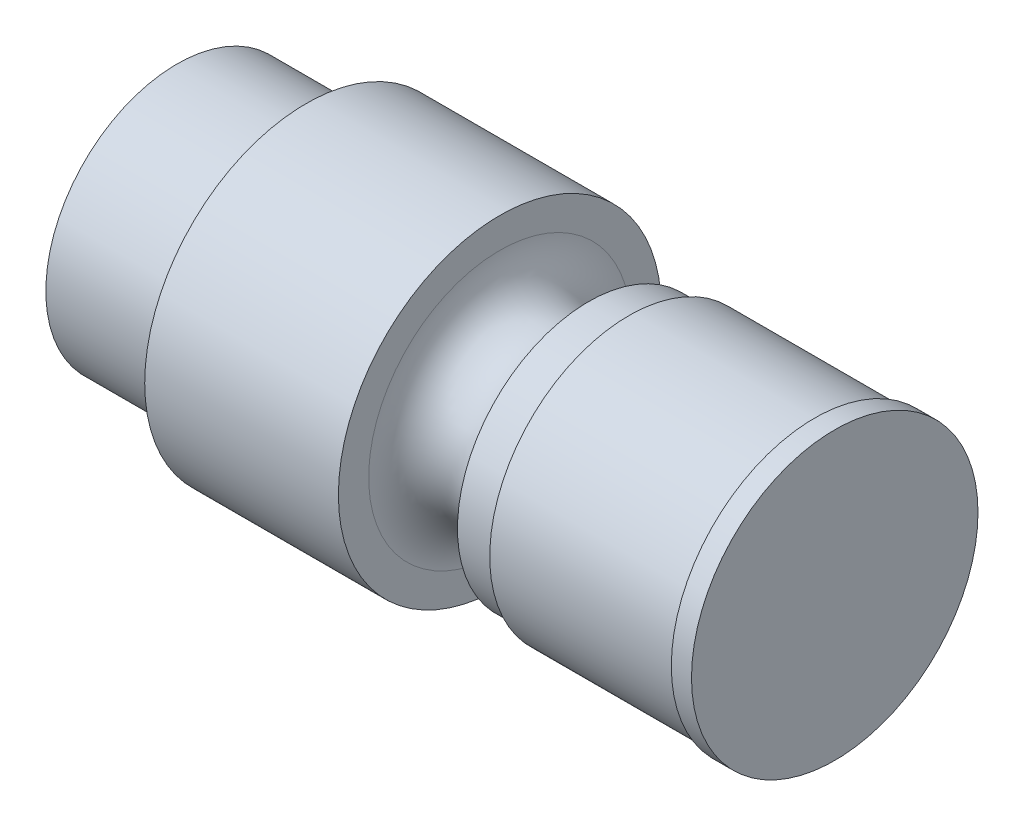
ISO-10303-21;
HEADER;
FILE_DESCRIPTION(('STEP AP214'),'2;1');
FILE_NAME('part.step','',(''),(''),'','','');
FILE_SCHEMA(('AUTOMOTIVE_DESIGN { 1 0 10303 214 1 1 1 1 }'));
ENDSEC;
DATA;
#1=APPLICATION_CONTEXT('core data for automotive mechanical design processes');
#2=APPLICATION_PROTOCOL_DEFINITION('international standard','automotive_design',2000,#1);
#3=PRODUCT_CONTEXT('',#1,'mechanical');
#4=PRODUCT('Part','Part','',(#3));
#5=PRODUCT_RELATED_PRODUCT_CATEGORY('part','',(#4));
#6=PRODUCT_DEFINITION_FORMATION('','',#4);
#7=PRODUCT_DEFINITION_CONTEXT('part definition',#1,'design');
#8=PRODUCT_DEFINITION('design','',#6,#7);
#9=PRODUCT_DEFINITION_SHAPE('','',#8);
#10=(LENGTH_UNIT() NAMED_UNIT(*) SI_UNIT(.MILLI.,.METRE.));
#11=(NAMED_UNIT(*) PLANE_ANGLE_UNIT() SI_UNIT($,.RADIAN.));
#12=(NAMED_UNIT(*) SI_UNIT($,.STERADIAN.) SOLID_ANGLE_UNIT());
#13=UNCERTAINTY_MEASURE_WITH_UNIT(LENGTH_MEASURE(1.E-05),#10,'distance_accuracy_value','');
#14=(GEOMETRIC_REPRESENTATION_CONTEXT(3) GLOBAL_UNCERTAINTY_ASSIGNED_CONTEXT((#13)) GLOBAL_UNIT_ASSIGNED_CONTEXT((#10,
#11,#12)) REPRESENTATION_CONTEXT('',''));
#15=CARTESIAN_POINT('',(0.,0.,0.));
#16=DIRECTION('',(0.,0.,1.));
#17=DIRECTION('',(1.,0.,0.));
#18=AXIS2_PLACEMENT_3D('',#15,#16,#17);
#19=CARTESIAN_POINT('',(0.,0.,0.));
#20=DIRECTION('',(1.,0.,0.));
#21=DIRECTION('',(0.,0.,-1.));
#22=AXIS2_PLACEMENT_3D('',#19,#20,#21);
#23=PLANE('',#22);
#24=CARTESIAN_POINT('',(0.,32.5,0.));
#25=DIRECTION('',(1.,0.,0.));
#26=DIRECTION('',(0.,0.,-1.));
#27=AXIS2_PLACEMENT_3D('',#24,#25,#26);
#28=CIRCLE('',#27,32.5);
#29=CARTESIAN_POINT('',(0.,32.5,-32.5));
#30=VERTEX_POINT('',#29);
#31=EDGE_CURVE('E10',#30,#30,#28,.T.);
#32=ORIENTED_EDGE('',*,*,#31,.F.);
#33=EDGE_LOOP('',(#32));
#34=FACE_BOUND('',#33,.T.);
#35=ADVANCED_FACE('F33',(#34),#23,.F.);
#36=CARTESIAN_POINT('',(163.,32.5,0.));
#37=DIRECTION('',(1.,0.,0.));
#38=DIRECTION('',(0.,0.,-1.));
#39=AXIS2_PLACEMENT_3D('',#36,#37,#38);
#40=CYLINDRICAL_SURFACE('',#39,32.5);
#41=CARTESIAN_POINT('',(32.,32.5,0.));
#42=DIRECTION('',(1.,0.,0.));
#43=DIRECTION('',(0.,0.,-1.));
#44=AXIS2_PLACEMENT_3D('',#41,#42,#43);
#45=CIRCLE('',#44,32.5);
#46=CARTESIAN_POINT('',(32.,32.5,-32.5));
#47=VERTEX_POINT('',#46);
#48=EDGE_CURVE('E39',#47,#47,#45,.T.);
#49=ORIENTED_EDGE('',*,*,#48,.F.);
#50=EDGE_LOOP('',(#49));
#51=FACE_BOUND('',#50,.T.);
#52=ORIENTED_EDGE('',*,*,#31,.T.);
#53=EDGE_LOOP('',(#52));
#54=FACE_BOUND('',#53,.T.);
#55=ADVANCED_FACE('F126',(#51,#54),#40,.T.);
#56=CARTESIAN_POINT('',(32.,0.,0.));
#57=DIRECTION('',(1.,0.,0.));
#58=DIRECTION('',(0.,0.,-1.));
#59=AXIS2_PLACEMENT_3D('',#56,#57,#58);
#60=PLANE('',#59);
#61=CARTESIAN_POINT('',(32.,32.5,0.));
#62=DIRECTION('',(1.,0.,0.));
#63=DIRECTION('',(0.,0.,-1.));
#64=AXIS2_PLACEMENT_3D('',#61,#62,#63);
#65=CIRCLE('',#64,40.);
#66=CARTESIAN_POINT('',(32.,32.5,-40.));
#67=VERTEX_POINT('',#66);
#68=EDGE_CURVE('E43',#67,#67,#65,.T.);
#69=ORIENTED_EDGE('',*,*,#68,.F.);
#70=EDGE_LOOP('',(#69));
#71=FACE_BOUND('',#70,.T.);
#72=ORIENTED_EDGE('',*,*,#48,.T.);
#73=EDGE_LOOP('',(#72));
#74=FACE_BOUND('',#73,.T.);
#75=ADVANCED_FACE('F121',(#71,#74),#60,.F.);
#76=CARTESIAN_POINT('',(163.,32.5,0.));
#77=DIRECTION('',(1.,0.,0.));
#78=DIRECTION('',(0.,0.,-1.));
#79=AXIS2_PLACEMENT_3D('',#76,#77,#78);
#80=CYLINDRICAL_SURFACE('',#79,40.);
#81=CARTESIAN_POINT('',(80.,32.5,0.));
#82=DIRECTION('',(1.,0.,0.));
#83=DIRECTION('',(0.,0.,-1.));
#84=AXIS2_PLACEMENT_3D('',#81,#82,#83);
#85=CIRCLE('',#84,40.);
#86=CARTESIAN_POINT('',(80.,32.5,-40.));
#87=VERTEX_POINT('',#86);
#88=EDGE_CURVE('E47',#87,#87,#85,.T.);
#89=ORIENTED_EDGE('',*,*,#88,.F.);
#90=EDGE_LOOP('',(#89));
#91=FACE_BOUND('',#90,.T.);
#92=ORIENTED_EDGE('',*,*,#68,.T.);
#93=EDGE_LOOP('',(#92));
#94=FACE_BOUND('',#93,.T.);
#95=ADVANCED_FACE('F115',(#91,#94),#80,.T.);
#96=CARTESIAN_POINT('',(80.,-7.5,0.));
#97=DIRECTION('',(-1.,0.,0.));
#98=DIRECTION('',(0.,0.,1.));
#99=AXIS2_PLACEMENT_3D('',#96,#97,#98);
#100=PLANE('',#99);
#101=CARTESIAN_POINT('',(80.,32.5,0.));
#102=DIRECTION('',(1.,0.,0.));
#103=DIRECTION('',(0.,0.,-1.));
#104=AXIS2_PLACEMENT_3D('',#101,#102,#103);
#105=CIRCLE('',#104,32.5);
#106=CARTESIAN_POINT('',(80.,32.5,-32.5));
#107=VERTEX_POINT('',#106);
#108=EDGE_CURVE('E52',#107,#107,#105,.T.);
#109=ORIENTED_EDGE('',*,*,#108,.F.);
#110=EDGE_LOOP('',(#109));
#111=FACE_BOUND('',#110,.T.);
#112=ORIENTED_EDGE('',*,*,#88,.T.);
#113=EDGE_LOOP('',(#112));
#114=FACE_BOUND('',#113,.T.);
#115=ADVANCED_FACE('F109',(#111,#114),#100,.F.);
#116=CARTESIAN_POINT('',(91.,32.5,0.));
#117=DIRECTION('',(1.,0.,0.));
#118=DIRECTION('',(0.,0.,-1.));
#119=AXIS2_PLACEMENT_3D('',#116,#117,#118);
#120=TOROIDAL_SURFACE('',#119,32.5,11.);
#121=CARTESIAN_POINT('',(102.,32.5,0.));
#122=DIRECTION('',(1.,0.,0.));
#123=DIRECTION('',(0.,0.,-1.));
#124=AXIS2_PLACEMENT_3D('',#121,#122,#123);
#125=CIRCLE('',#124,32.5);
#126=CARTESIAN_POINT('',(102.,32.5,-32.5));
#127=VERTEX_POINT('',#126);
#128=EDGE_CURVE('E55',#127,#127,#125,.T.);
#129=ORIENTED_EDGE('',*,*,#128,.F.);
#130=EDGE_LOOP('',(#129));
#131=FACE_BOUND('',#130,.T.);
#132=ORIENTED_EDGE('',*,*,#108,.T.);
#133=EDGE_LOOP('',(#132));
#134=FACE_BOUND('',#133,.T.);
#135=ADVANCED_FACE('F103',(#131,#134),#120,.F.);
#136=CARTESIAN_POINT('',(163.,32.5,0.));
#137=DIRECTION('',(1.,0.,0.));
#138=DIRECTION('',(0.,0.,-1.));
#139=AXIS2_PLACEMENT_3D('',#136,#137,#138);
#140=CYLINDRICAL_SURFACE('',#139,32.5);
#141=CARTESIAN_POINT('',(112.,32.5,0.));
#142=DIRECTION('',(1.,0.,0.));
#143=DIRECTION('',(0.,0.,-1.));
#144=AXIS2_PLACEMENT_3D('',#141,#142,#143);
#145=CIRCLE('',#144,32.5);
#146=CARTESIAN_POINT('',(112.,32.5,-32.5));
#147=VERTEX_POINT('',#146);
#148=EDGE_CURVE('E58',#147,#147,#145,.T.);
#149=ORIENTED_EDGE('',*,*,#148,.F.);
#150=EDGE_LOOP('',(#149));
#151=FACE_BOUND('',#150,.T.);
#152=ORIENTED_EDGE('',*,*,#128,.T.);
#153=EDGE_LOOP('',(#152));
#154=FACE_BOUND('',#153,.T.);
#155=ADVANCED_FACE('F97',(#151,#154),#140,.T.);
#156=CARTESIAN_POINT('',(112.,0.,0.));
#157=DIRECTION('',(1.,0.,0.));
#158=DIRECTION('',(0.,0.,-1.));
#159=AXIS2_PLACEMENT_3D('',#156,#157,#158);
#160=PLANE('',#159);
#161=CARTESIAN_POINT('',(112.,32.5,0.));
#162=DIRECTION('',(1.,0.,0.));
#163=DIRECTION('',(0.,0.,-1.));
#164=AXIS2_PLACEMENT_3D('',#161,#162,#163);
#165=CIRCLE('',#164,34.5);
#166=CARTESIAN_POINT('',(112.,32.5,-34.5));
#167=VERTEX_POINT('',#166);
#168=EDGE_CURVE('E61',#167,#167,#165,.T.);
#169=ORIENTED_EDGE('',*,*,#168,.F.);
#170=EDGE_LOOP('',(#169));
#171=FACE_BOUND('',#170,.T.);
#172=ORIENTED_EDGE('',*,*,#148,.T.);
#173=EDGE_LOOP('',(#172));
#174=FACE_BOUND('',#173,.T.);
#175=ADVANCED_FACE('F91',(#171,#174),#160,.F.);
#176=CARTESIAN_POINT('',(163.,32.5,0.));
#177=DIRECTION('',(1.,0.,0.));
#178=DIRECTION('',(0.,0.,-1.));
#179=AXIS2_PLACEMENT_3D('',#176,#177,#178);
#180=CYLINDRICAL_SURFACE('',#179,34.5);
#181=CARTESIAN_POINT('',(158.,32.5,0.));
#182=DIRECTION('',(1.,0.,0.));
#183=DIRECTION('',(0.,0.,-1.));
#184=AXIS2_PLACEMENT_3D('',#181,#182,#183);
#185=CIRCLE('',#184,34.5);
#186=CARTESIAN_POINT('',(158.,32.5,-34.5));
#187=VERTEX_POINT('',#186);
#188=EDGE_CURVE('E64',#187,#187,#185,.T.);
#189=ORIENTED_EDGE('',*,*,#188,.F.);
#190=EDGE_LOOP('',(#189));
#191=FACE_BOUND('',#190,.T.);
#192=ORIENTED_EDGE('',*,*,#168,.T.);
#193=EDGE_LOOP('',(#192));
#194=FACE_BOUND('',#193,.T.);
#195=ADVANCED_FACE('F85',(#191,#194),#180,.T.);
#196=CARTESIAN_POINT('',(158.,-2.,0.));
#197=DIRECTION('',(1.,0.,0.));
#198=DIRECTION('',(0.,0.,-1.));
#199=AXIS2_PLACEMENT_3D('',#196,#197,#198);
#200=PLANE('',#199);
#201=CARTESIAN_POINT('',(158.,32.5,0.));
#202=DIRECTION('',(1.,0.,0.));
#203=DIRECTION('',(0.,0.,-1.));
#204=AXIS2_PLACEMENT_3D('',#201,#202,#203);
#205=CIRCLE('',#204,35.5);
#206=CARTESIAN_POINT('',(158.,32.5,-35.5));
#207=VERTEX_POINT('',#206);
#208=EDGE_CURVE('E67',#207,#207,#205,.T.);
#209=ORIENTED_EDGE('',*,*,#208,.F.);
#210=EDGE_LOOP('',(#209));
#211=FACE_BOUND('',#210,.T.);
#212=ORIENTED_EDGE('',*,*,#188,.T.);
#213=EDGE_LOOP('',(#212));
#214=FACE_BOUND('',#213,.T.);
#215=ADVANCED_FACE('F79',(#211,#214),#200,.F.);
#216=CARTESIAN_POINT('',(163.,32.5,0.));
#217=DIRECTION('',(1.,0.,0.));
#218=DIRECTION('',(0.,0.,-1.));
#219=AXIS2_PLACEMENT_3D('',#216,#217,#218);
#220=CYLINDRICAL_SURFACE('',#219,35.5);
#221=CARTESIAN_POINT('',(163.,32.5,0.));
#222=DIRECTION('',(1.,0.,0.));
#223=DIRECTION('',(0.,0.,-1.));
#224=AXIS2_PLACEMENT_3D('',#221,#222,#223);
#225=CIRCLE('',#224,35.5);
#226=CARTESIAN_POINT('',(163.,32.5,-35.5));
#227=VERTEX_POINT('',#226);
#228=EDGE_CURVE('E70',#227,#227,#225,.T.);
#229=ORIENTED_EDGE('',*,*,#228,.F.);
#230=EDGE_LOOP('',(#229));
#231=FACE_BOUND('',#230,.T.);
#232=ORIENTED_EDGE('',*,*,#208,.T.);
#233=EDGE_LOOP('',(#232));
#234=FACE_BOUND('',#233,.T.);
#235=ADVANCED_FACE('F76',(#231,#234),#220,.T.);
#236=CARTESIAN_POINT('',(163.,-3.,0.));
#237=DIRECTION('',(-1.,0.,0.));
#238=DIRECTION('',(0.,0.,1.));
#239=AXIS2_PLACEMENT_3D('',#236,#237,#238);
#240=PLANE('',#239);
#241=ORIENTED_EDGE('',*,*,#228,.T.);
#242=EDGE_LOOP('',(#241));
#243=FACE_BOUND('',#242,.T.);
#244=ADVANCED_FACE('F74',(#243),#240,.F.);
#245=CLOSED_SHELL('',(#35,#55,#75,#95,#115,#135,#155,#175,#195,#215,#235,#244));
#246=MANIFOLD_SOLID_BREP('B2',#245);
#247=ADVANCED_BREP_SHAPE_REPRESENTATION('',(#18,#246),#14);
#248=SHAPE_DEFINITION_REPRESENTATION(#9,#247);
ENDSEC;
END-ISO-10303-21;
